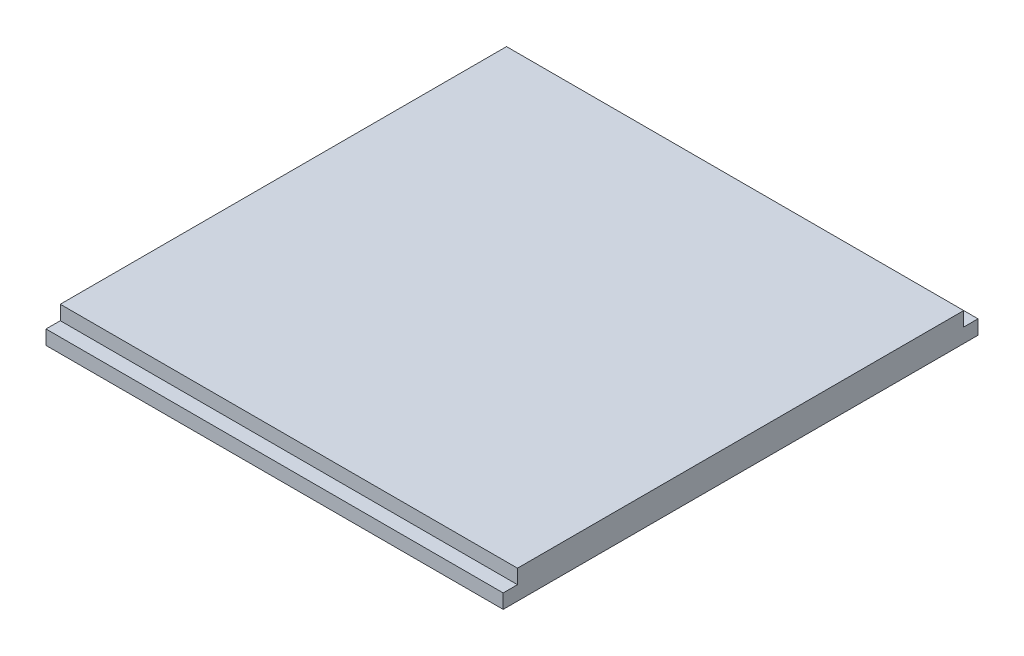
ISO-10303-21;
HEADER;
FILE_DESCRIPTION(('STEP AP214'),'2;1');
FILE_NAME('part.step','',(''),(''),'','','');
FILE_SCHEMA(('AUTOMOTIVE_DESIGN { 1 0 10303 214 1 1 1 1 }'));
ENDSEC;
DATA;
#1=APPLICATION_CONTEXT('core data for automotive mechanical design processes');
#2=APPLICATION_PROTOCOL_DEFINITION('international standard','automotive_design',2000,#1);
#3=PRODUCT_CONTEXT('',#1,'mechanical');
#4=PRODUCT('Part','Part','',(#3));
#5=PRODUCT_RELATED_PRODUCT_CATEGORY('part','',(#4));
#6=PRODUCT_DEFINITION_FORMATION('','',#4);
#7=PRODUCT_DEFINITION_CONTEXT('part definition',#1,'design');
#8=PRODUCT_DEFINITION('design','',#6,#7);
#9=PRODUCT_DEFINITION_SHAPE('','',#8);
#10=(LENGTH_UNIT() NAMED_UNIT(*) SI_UNIT(.MILLI.,.METRE.));
#11=(NAMED_UNIT(*) PLANE_ANGLE_UNIT() SI_UNIT($,.RADIAN.));
#12=(NAMED_UNIT(*) SI_UNIT($,.STERADIAN.) SOLID_ANGLE_UNIT());
#13=UNCERTAINTY_MEASURE_WITH_UNIT(LENGTH_MEASURE(1.E-05),#10,'distance_accuracy_value','');
#14=(GEOMETRIC_REPRESENTATION_CONTEXT(3) GLOBAL_UNCERTAINTY_ASSIGNED_CONTEXT((#13)) GLOBAL_UNIT_ASSIGNED_CONTEXT((#10,
#11,#12)) REPRESENTATION_CONTEXT('',''));
#15=CARTESIAN_POINT('',(0.,0.,0.));
#16=DIRECTION('',(0.,0.,1.));
#17=DIRECTION('',(1.,0.,0.));
#18=AXIS2_PLACEMENT_3D('',#15,#16,#17);
#19=CARTESIAN_POINT('',(-960.,120.,-996.999999999999));
#20=DIRECTION('',(1.,0.,0.));
#21=DIRECTION('',(0.,0.,-1.));
#22=AXIS2_PLACEMENT_3D('',#19,#20,#21);
#23=PLANE('',#22);
#24=DIRECTION('',(0.,0.,1.));
#25=VECTOR('',#24,1.);
#26=CARTESIAN_POINT('',(-960.,120.,-996.999999999999));
#27=LINE('',#26,#25);
#28=CARTESIAN_POINT('',(-960.,120.,-936.999999999999));
#29=VERTEX_POINT('',#28);
#30=CARTESIAN_POINT('',(-960.,120.,937.000000000001));
#31=VERTEX_POINT('',#30);
#32=EDGE_CURVE('E127',#29,#31,#27,.T.);
#33=ORIENTED_EDGE('',*,*,#32,.F.);
#34=DIRECTION('',(0.,1.,0.));
#35=VECTOR('',#34,1.);
#36=CARTESIAN_POINT('',(-960.,120.,-936.999999999999));
#37=LINE('',#36,#35);
#38=CARTESIAN_POINT('',(-960.,60.,-936.999999999999));
#39=VERTEX_POINT('',#38);
#40=EDGE_CURVE('E56',#39,#29,#37,.T.);
#41=ORIENTED_EDGE('',*,*,#40,.F.);
#42=DIRECTION('',(0.,0.,1.));
#43=VECTOR('',#42,1.);
#44=CARTESIAN_POINT('',(-960.,59.9999999999996,-996.999999999999));
#45=LINE('',#44,#43);
#46=CARTESIAN_POINT('',(-960.,59.9999999999996,-996.999999999999));
#47=VERTEX_POINT('',#46);
#48=EDGE_CURVE('E148',#47,#39,#45,.T.);
#49=ORIENTED_EDGE('',*,*,#48,.F.);
#50=DIRECTION('',(0.,-1.,0.));
#51=VECTOR('',#50,1.);
#52=CARTESIAN_POINT('',(-960.,120.,-996.999999999999));
#53=LINE('',#52,#51);
#54=CARTESIAN_POINT('',(-960.,0.,-996.999999999999));
#55=VERTEX_POINT('',#54);
#56=EDGE_CURVE('E115',#47,#55,#53,.T.);
#57=ORIENTED_EDGE('',*,*,#56,.T.);
#58=DIRECTION('',(0.,0.,1.));
#59=VECTOR('',#58,1.);
#60=CARTESIAN_POINT('',(-960.,0.,-996.999999999999));
#61=LINE('',#60,#59);
#62=CARTESIAN_POINT('',(-960.,0.,997.000000000001));
#63=VERTEX_POINT('',#62);
#64=EDGE_CURVE('E132',#55,#63,#61,.T.);
#65=ORIENTED_EDGE('',*,*,#64,.T.);
#66=DIRECTION('',(0.,-1.,0.));
#67=VECTOR('',#66,1.);
#68=CARTESIAN_POINT('',(-960.,120.,997.000000000001));
#69=LINE('',#68,#67);
#70=CARTESIAN_POINT('',(-960.,60.,997.000000000001));
#71=VERTEX_POINT('',#70);
#72=EDGE_CURVE('E11',#71,#63,#69,.T.);
#73=ORIENTED_EDGE('',*,*,#72,.F.);
#74=DIRECTION('',(0.,0.,1.));
#75=VECTOR('',#74,1.);
#76=CARTESIAN_POINT('',(-960.,60.,997.000000000001));
#77=LINE('',#76,#75);
#78=CARTESIAN_POINT('',(-960.,60.,937.000000000001));
#79=VERTEX_POINT('',#78);
#80=EDGE_CURVE('E149',#79,#71,#77,.T.);
#81=ORIENTED_EDGE('',*,*,#80,.F.);
#82=DIRECTION('',(0.,-1.,0.));
#83=VECTOR('',#82,1.);
#84=CARTESIAN_POINT('',(-960.,120.,937.000000000001));
#85=LINE('',#84,#83);
#86=EDGE_CURVE('E151',#31,#79,#85,.T.);
#87=ORIENTED_EDGE('',*,*,#86,.F.);
#88=EDGE_LOOP('',(#33,#41,#49,#57,#65,#73,#81,#87));
#89=FACE_BOUND('',#88,.T.);
#90=ADVANCED_FACE('F34',(#89),#23,.F.);
#91=CARTESIAN_POINT('',(960.,120.,997.));
#92=DIRECTION('',(0.,0.,-1.));
#93=DIRECTION('',(-1.,0.,0.));
#94=AXIS2_PLACEMENT_3D('',#91,#92,#93);
#95=PLANE('',#94);
#96=DIRECTION('',(0.,-1.,0.));
#97=VECTOR('',#96,1.);
#98=CARTESIAN_POINT('',(960.,120.,997.));
#99=LINE('',#98,#97);
#100=CARTESIAN_POINT('',(960.000000000001,60.,997.));
#101=VERTEX_POINT('',#100);
#102=CARTESIAN_POINT('',(960.,0.,997.));
#103=VERTEX_POINT('',#102);
#104=EDGE_CURVE('E41',#101,#103,#99,.T.);
#105=ORIENTED_EDGE('',*,*,#104,.F.);
#106=DIRECTION('',(-1.,0.,0.));
#107=VECTOR('',#106,1.);
#108=CARTESIAN_POINT('',(960.000000000001,60.,997.));
#109=LINE('',#108,#107);
#110=EDGE_CURVE('E145',#101,#71,#109,.T.);
#111=ORIENTED_EDGE('',*,*,#110,.T.);
#112=ORIENTED_EDGE('',*,*,#72,.T.);
#113=DIRECTION('',(1.,0.,0.));
#114=VECTOR('',#113,1.);
#115=CARTESIAN_POINT('',(960.,0.,997.));
#116=LINE('',#115,#114);
#117=EDGE_CURVE('E129',#63,#103,#116,.T.);
#118=ORIENTED_EDGE('',*,*,#117,.T.);
#119=EDGE_LOOP('',(#105,#111,#112,#118));
#120=FACE_BOUND('',#119,.T.);
#121=ADVANCED_FACE('F175',(#120),#95,.F.);
#122=CARTESIAN_POINT('',(960.,120.,-997.));
#123=DIRECTION('',(-1.,0.,0.));
#124=DIRECTION('',(0.,0.,1.));
#125=AXIS2_PLACEMENT_3D('',#122,#123,#124);
#126=PLANE('',#125);
#127=DIRECTION('',(0.,0.,1.));
#128=VECTOR('',#127,1.);
#129=CARTESIAN_POINT('',(960.,59.9999999999996,-997.));
#130=LINE('',#129,#128);
#131=CARTESIAN_POINT('',(960.,59.9999999999996,-997.));
#132=VERTEX_POINT('',#131);
#133=CARTESIAN_POINT('',(960.,60.,-937.));
#134=VERTEX_POINT('',#133);
#135=EDGE_CURVE('E96',#132,#134,#130,.T.);
#136=ORIENTED_EDGE('',*,*,#135,.T.);
#137=DIRECTION('',(0.,1.,0.));
#138=VECTOR('',#137,1.);
#139=CARTESIAN_POINT('',(960.,120.,-937.));
#140=LINE('',#139,#138);
#141=CARTESIAN_POINT('',(960.,120.,-937.));
#142=VERTEX_POINT('',#141);
#143=EDGE_CURVE('E107',#134,#142,#140,.T.);
#144=ORIENTED_EDGE('',*,*,#143,.T.);
#145=DIRECTION('',(0.,0.,-1.));
#146=VECTOR('',#145,1.);
#147=CARTESIAN_POINT('',(960.,120.,-997.));
#148=LINE('',#147,#146);
#149=CARTESIAN_POINT('',(960.,120.,937.));
#150=VERTEX_POINT('',#149);
#151=EDGE_CURVE('E122',#150,#142,#148,.T.);
#152=ORIENTED_EDGE('',*,*,#151,.F.);
#153=DIRECTION('',(0.,-1.,0.));
#154=VECTOR('',#153,1.);
#155=CARTESIAN_POINT('',(960.000000000001,120.,937.));
#156=LINE('',#155,#154);
#157=CARTESIAN_POINT('',(960.000000000001,60.,937.));
#158=VERTEX_POINT('',#157);
#159=EDGE_CURVE('E48',#150,#158,#156,.T.);
#160=ORIENTED_EDGE('',*,*,#159,.T.);
#161=DIRECTION('',(0.,0.,1.));
#162=VECTOR('',#161,1.);
#163=CARTESIAN_POINT('',(960.000000000001,60.,997.));
#164=LINE('',#163,#162);
#165=EDGE_CURVE('E143',#158,#101,#164,.T.);
#166=ORIENTED_EDGE('',*,*,#165,.T.);
#167=ORIENTED_EDGE('',*,*,#104,.T.);
#168=DIRECTION('',(0.,0.,-1.));
#169=VECTOR('',#168,1.);
#170=CARTESIAN_POINT('',(960.,0.,-997.));
#171=LINE('',#170,#169);
#172=CARTESIAN_POINT('',(960.,0.,-997.));
#173=VERTEX_POINT('',#172);
#174=EDGE_CURVE('E119',#103,#173,#171,.T.);
#175=ORIENTED_EDGE('',*,*,#174,.T.);
#176=DIRECTION('',(0.,-1.,0.));
#177=VECTOR('',#176,1.);
#178=CARTESIAN_POINT('',(960.,120.,-997.));
#179=LINE('',#178,#177);
#180=EDGE_CURVE('E113',#132,#173,#179,.T.);
#181=ORIENTED_EDGE('',*,*,#180,.F.);
#182=EDGE_LOOP('',(#136,#144,#152,#160,#166,#167,#175,#181));
#183=FACE_BOUND('',#182,.T.);
#184=ADVANCED_FACE('F117',(#183),#126,.F.);
#185=CARTESIAN_POINT('',(960.,120.,-997.));
#186=DIRECTION('',(0.,0.,1.));
#187=DIRECTION('',(1.,0.,0.));
#188=AXIS2_PLACEMENT_3D('',#185,#186,#187);
#189=PLANE('',#188);
#190=ORIENTED_EDGE('',*,*,#56,.F.);
#191=DIRECTION('',(-1.,0.,0.));
#192=VECTOR('',#191,1.);
#193=CARTESIAN_POINT('',(960.,59.9999999999996,-997.));
#194=LINE('',#193,#192);
#195=EDGE_CURVE('E100',#132,#47,#194,.T.);
#196=ORIENTED_EDGE('',*,*,#195,.F.);
#197=ORIENTED_EDGE('',*,*,#180,.T.);
#198=DIRECTION('',(-1.,0.,0.));
#199=VECTOR('',#198,1.);
#200=CARTESIAN_POINT('',(960.,0.,-997.));
#201=LINE('',#200,#199);
#202=EDGE_CURVE('E125',#173,#55,#201,.T.);
#203=ORIENTED_EDGE('',*,*,#202,.T.);
#204=EDGE_LOOP('',(#190,#196,#197,#203));
#205=FACE_BOUND('',#204,.T.);
#206=ADVANCED_FACE('F111',(#205),#189,.F.);
#207=CARTESIAN_POINT('',(0.,120.,0.));
#208=DIRECTION('',(0.,-1.,0.));
#209=DIRECTION('',(0.,0.,-1.));
#210=AXIS2_PLACEMENT_3D('',#207,#208,#209);
#211=PLANE('',#210);
#212=ORIENTED_EDGE('',*,*,#151,.T.);
#213=DIRECTION('',(-1.,0.,0.));
#214=VECTOR('',#213,1.);
#215=CARTESIAN_POINT('',(960.,120.,-937.));
#216=LINE('',#215,#214);
#217=EDGE_CURVE('E135',#142,#29,#216,.T.);
#218=ORIENTED_EDGE('',*,*,#217,.T.);
#219=ORIENTED_EDGE('',*,*,#32,.T.);
#220=DIRECTION('',(-1.,0.,0.));
#221=VECTOR('',#220,1.);
#222=CARTESIAN_POINT('',(960.000000000001,120.,937.));
#223=LINE('',#222,#221);
#224=EDGE_CURVE('E140',#150,#31,#223,.T.);
#225=ORIENTED_EDGE('',*,*,#224,.F.);
#226=EDGE_LOOP('',(#212,#218,#219,#225));
#227=FACE_BOUND('',#226,.T.);
#228=ADVANCED_FACE('F163',(#227),#211,.F.);
#229=CARTESIAN_POINT('',(0.,0.,0.));
#230=DIRECTION('',(0.,-1.,0.));
#231=DIRECTION('',(0.,0.,-1.));
#232=AXIS2_PLACEMENT_3D('',#229,#230,#231);
#233=PLANE('',#232);
#234=ORIENTED_EDGE('',*,*,#64,.F.);
#235=ORIENTED_EDGE('',*,*,#202,.F.);
#236=ORIENTED_EDGE('',*,*,#174,.F.);
#237=ORIENTED_EDGE('',*,*,#117,.F.);
#238=EDGE_LOOP('',(#234,#235,#236,#237));
#239=FACE_BOUND('',#238,.T.);
#240=ADVANCED_FACE('F179',(#239),#233,.T.);
#241=CARTESIAN_POINT('',(960.000000000001,60.,997.));
#242=DIRECTION('',(0.,-1.,0.));
#243=DIRECTION('',(0.,0.,-1.));
#244=AXIS2_PLACEMENT_3D('',#241,#242,#243);
#245=PLANE('',#244);
#246=ORIENTED_EDGE('',*,*,#80,.T.);
#247=ORIENTED_EDGE('',*,*,#110,.F.);
#248=ORIENTED_EDGE('',*,*,#165,.F.);
#249=DIRECTION('',(-1.,0.,0.));
#250=VECTOR('',#249,1.);
#251=CARTESIAN_POINT('',(960.000000000001,60.,937.));
#252=LINE('',#251,#250);
#253=EDGE_CURVE('E142',#158,#79,#252,.T.);
#254=ORIENTED_EDGE('',*,*,#253,.T.);
#255=EDGE_LOOP('',(#246,#247,#248,#254));
#256=FACE_BOUND('',#255,.T.);
#257=ADVANCED_FACE('F171',(#256),#245,.F.);
#258=CARTESIAN_POINT('',(960.000000000001,120.,937.));
#259=DIRECTION('',(0.,0.,-1.));
#260=DIRECTION('',(0.,1.,0.));
#261=AXIS2_PLACEMENT_3D('',#258,#259,#260);
#262=PLANE('',#261);
#263=ORIENTED_EDGE('',*,*,#86,.T.);
#264=ORIENTED_EDGE('',*,*,#253,.F.);
#265=ORIENTED_EDGE('',*,*,#159,.F.);
#266=ORIENTED_EDGE('',*,*,#224,.T.);
#267=EDGE_LOOP('',(#263,#264,#265,#266));
#268=FACE_BOUND('',#267,.T.);
#269=ADVANCED_FACE('F166',(#268),#262,.F.);
#270=CARTESIAN_POINT('',(960.,120.,-937.));
#271=DIRECTION('',(0.,0.,1.));
#272=DIRECTION('',(1.,0.,0.));
#273=AXIS2_PLACEMENT_3D('',#270,#271,#272);
#274=PLANE('',#273);
#275=ORIENTED_EDGE('',*,*,#40,.T.);
#276=ORIENTED_EDGE('',*,*,#217,.F.);
#277=ORIENTED_EDGE('',*,*,#143,.F.);
#278=DIRECTION('',(-1.,0.,0.));
#279=VECTOR('',#278,1.);
#280=CARTESIAN_POINT('',(960.,60.,-937.));
#281=LINE('',#280,#279);
#282=EDGE_CURVE('E102',#134,#39,#281,.T.);
#283=ORIENTED_EDGE('',*,*,#282,.T.);
#284=EDGE_LOOP('',(#275,#276,#277,#283));
#285=FACE_BOUND('',#284,.T.);
#286=ADVANCED_FACE('F222',(#285),#274,.F.);
#287=CARTESIAN_POINT('',(960.,59.9999999999996,-997.));
#288=DIRECTION('',(0.,-1.,0.));
#289=DIRECTION('',(0.,0.,-1.));
#290=AXIS2_PLACEMENT_3D('',#287,#288,#289);
#291=PLANE('',#290);
#292=ORIENTED_EDGE('',*,*,#48,.T.);
#293=ORIENTED_EDGE('',*,*,#282,.F.);
#294=ORIENTED_EDGE('',*,*,#135,.F.);
#295=ORIENTED_EDGE('',*,*,#195,.T.);
#296=EDGE_LOOP('',(#292,#293,#294,#295));
#297=FACE_BOUND('',#296,.T.);
#298=ADVANCED_FACE('F99',(#297),#291,.F.);
#299=CLOSED_SHELL('',(#90,#121,#184,#206,#228,#240,#257,#269,#286,#298));
#300=MANIFOLD_SOLID_BREP('B2',#299);
#301=ADVANCED_BREP_SHAPE_REPRESENTATION('',(#18,#300),#14);
#302=SHAPE_DEFINITION_REPRESENTATION(#9,#301);
ENDSEC;
END-ISO-10303-21;
